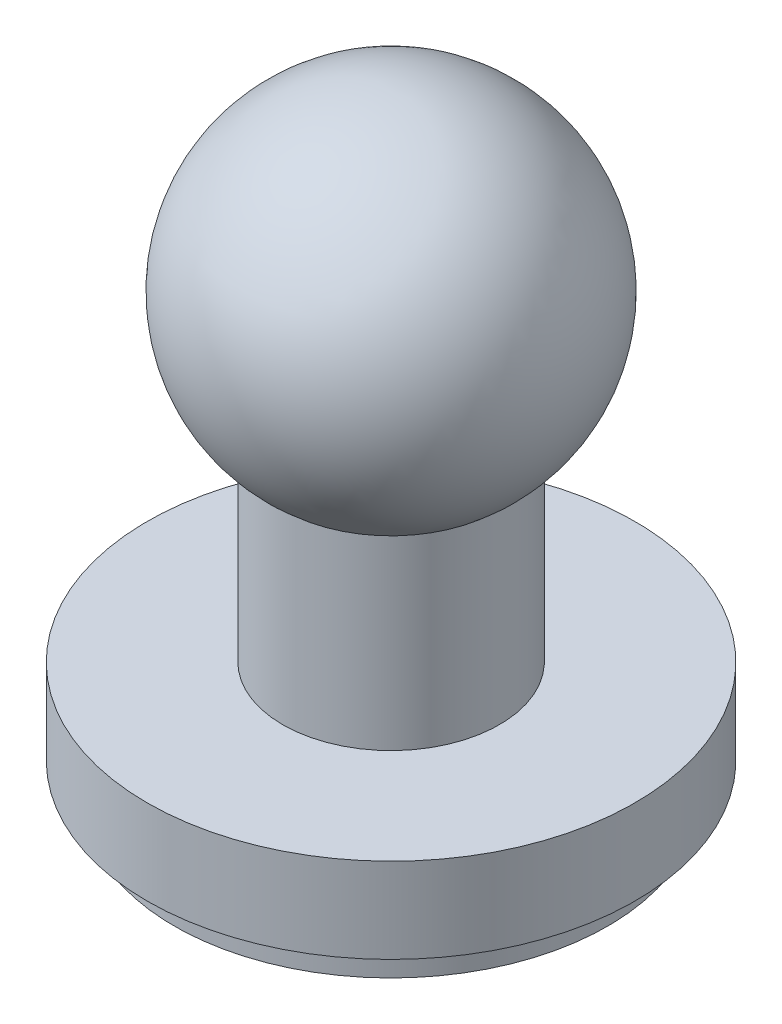
ISO-10303-21;
HEADER;
FILE_DESCRIPTION(('STEP AP214'),'2;1');
FILE_NAME('part.step','',(''),(''),'','','');
FILE_SCHEMA(('AUTOMOTIVE_DESIGN { 1 0 10303 214 1 1 1 1 }'));
ENDSEC;
DATA;
#1=APPLICATION_CONTEXT('core data for automotive mechanical design processes');
#2=APPLICATION_PROTOCOL_DEFINITION('international standard','automotive_design',2000,#1);
#3=PRODUCT_CONTEXT('',#1,'mechanical');
#4=PRODUCT('Part','Part','',(#3));
#5=PRODUCT_RELATED_PRODUCT_CATEGORY('part','',(#4));
#6=PRODUCT_DEFINITION_FORMATION('','',#4);
#7=PRODUCT_DEFINITION_CONTEXT('part definition',#1,'design');
#8=PRODUCT_DEFINITION('design','',#6,#7);
#9=PRODUCT_DEFINITION_SHAPE('','',#8);
#10=(LENGTH_UNIT() NAMED_UNIT(*) SI_UNIT(.MILLI.,.METRE.));
#11=(NAMED_UNIT(*) PLANE_ANGLE_UNIT() SI_UNIT($,.RADIAN.));
#12=(NAMED_UNIT(*) SI_UNIT($,.STERADIAN.) SOLID_ANGLE_UNIT());
#13=UNCERTAINTY_MEASURE_WITH_UNIT(LENGTH_MEASURE(1.E-05),#10,'distance_accuracy_value','');
#14=(GEOMETRIC_REPRESENTATION_CONTEXT(3) GLOBAL_UNCERTAINTY_ASSIGNED_CONTEXT((#13)) GLOBAL_UNIT_ASSIGNED_CONTEXT((#10,
#11,#12)) REPRESENTATION_CONTEXT('',''));
#15=CARTESIAN_POINT('',(0.,0.,0.));
#16=DIRECTION('',(0.,0.,1.));
#17=DIRECTION('',(1.,0.,0.));
#18=AXIS2_PLACEMENT_3D('',#15,#16,#17);
#19=CARTESIAN_POINT('',(0.,7.5,0.));
#20=DIRECTION('',(0.,-1.,0.));
#21=DIRECTION('',(0.,0.,-1.));
#22=AXIS2_PLACEMENT_3D('',#19,#20,#21);
#23=CYLINDRICAL_SURFACE('',#22,2.);
#24=CARTESIAN_POINT('',(0.,1.57,0.));
#25=DIRECTION('',(0.,1.,0.));
#26=DIRECTION('',(0.,0.,1.));
#27=AXIS2_PLACEMENT_3D('',#24,#25,#26);
#28=CIRCLE('',#27,2.);
#29=CARTESIAN_POINT('',(0.,1.57,2.));
#30=VERTEX_POINT('',#29);
#31=EDGE_CURVE('E45',#30,#30,#28,.T.);
#32=ORIENTED_EDGE('',*,*,#31,.T.);
#33=EDGE_LOOP('',(#32));
#34=FACE_BOUND('',#33,.T.);
#35=CARTESIAN_POINT('',(0.,5.00200080064064,0.));
#36=DIRECTION('',(0.,1.,0.));
#37=DIRECTION('',(0.,0.,1.));
#38=AXIS2_PLACEMENT_3D('',#35,#36,#37);
#39=CIRCLE('',#38,2.);
#40=CARTESIAN_POINT('',(0.,5.00200080064064,2.));
#41=VERTEX_POINT('',#40);
#42=EDGE_CURVE('E37',#41,#41,#39,.T.);
#43=ORIENTED_EDGE('',*,*,#42,.F.);
#44=EDGE_LOOP('',(#43));
#45=FACE_BOUND('',#44,.T.);
#46=ADVANCED_FACE('F33',(#34,#45),#23,.T.);
#47=CARTESIAN_POINT('',(0.,1.57,0.));
#48=DIRECTION('',(0.,-1.,0.));
#49=DIRECTION('',(0.,0.,-1.));
#50=AXIS2_PLACEMENT_3D('',#47,#48,#49);
#51=CYLINDRICAL_SURFACE('',#50,4.5);
#52=CARTESIAN_POINT('',(0.,1.57,0.));
#53=DIRECTION('',(0.,1.,0.));
#54=DIRECTION('',(0.,0.,1.));
#55=AXIS2_PLACEMENT_3D('',#52,#53,#54);
#56=CIRCLE('',#55,4.5);
#57=CARTESIAN_POINT('',(0.,1.57,4.5));
#58=VERTEX_POINT('',#57);
#59=EDGE_CURVE('E51',#58,#58,#56,.T.);
#60=ORIENTED_EDGE('',*,*,#59,.F.);
#61=EDGE_LOOP('',(#60));
#62=FACE_BOUND('',#61,.T.);
#63=CARTESIAN_POINT('',(0.,0.,0.));
#64=DIRECTION('',(0.,1.,0.));
#65=DIRECTION('',(0.,0.,1.));
#66=AXIS2_PLACEMENT_3D('',#63,#64,#65);
#67=CIRCLE('',#66,4.5);
#68=CARTESIAN_POINT('',(0.,0.,4.5));
#69=VERTEX_POINT('',#68);
#70=EDGE_CURVE('E53',#69,#69,#67,.T.);
#71=ORIENTED_EDGE('',*,*,#70,.T.);
#72=EDGE_LOOP('',(#71));
#73=FACE_BOUND('',#72,.T.);
#74=ADVANCED_FACE('F35',(#62,#73),#51,.T.);
#75=CARTESIAN_POINT('',(0.,1.57,0.));
#76=DIRECTION('',(0.,1.,0.));
#77=DIRECTION('',(0.,0.,1.));
#78=AXIS2_PLACEMENT_3D('',#75,#76,#77);
#79=PLANE('',#78);
#80=ORIENTED_EDGE('',*,*,#31,.F.);
#81=EDGE_LOOP('',(#80));
#82=FACE_BOUND('',#81,.T.);
#83=ORIENTED_EDGE('',*,*,#59,.T.);
#84=EDGE_LOOP('',(#83));
#85=FACE_BOUND('',#84,.T.);
#86=ADVANCED_FACE('F80',(#82,#85),#79,.T.);
#87=CARTESIAN_POINT('',(0.,0.,0.));
#88=DIRECTION('',(0.,1.,0.));
#89=DIRECTION('',(0.,0.,1.));
#90=AXIS2_PLACEMENT_3D('',#87,#88,#89);
#91=PLANE('',#90);
#92=CARTESIAN_POINT('',(0.,0.,0.));
#93=DIRECTION('',(0.,-1.,0.));
#94=DIRECTION('',(0.,0.,-1.));
#95=AXIS2_PLACEMENT_3D('',#92,#93,#94);
#96=CIRCLE('',#95,4.);
#97=CARTESIAN_POINT('',(0.,0.,-4.));
#98=VERTEX_POINT('',#97);
#99=EDGE_CURVE('E10',#98,#98,#96,.T.);
#100=ORIENTED_EDGE('',*,*,#99,.F.);
#101=EDGE_LOOP('',(#100));
#102=FACE_BOUND('',#101,.T.);
#103=ORIENTED_EDGE('',*,*,#70,.F.);
#104=EDGE_LOOP('',(#103));
#105=FACE_BOUND('',#104,.T.);
#106=ADVANCED_FACE('F71',(#102,#105),#91,.F.);
#107=CARTESIAN_POINT('',(0.,7.5,0.));
#108=DIRECTION('',(0.,0.,-1.));
#109=DIRECTION('',(1.,0.,0.));
#110=AXIS2_PLACEMENT_3D('',#107,#108,#109);
#111=SPHERICAL_SURFACE('',#110,3.2);
#112=CARTESIAN_POINT('',(0.,7.5,0.));
#113=DIRECTION('',(0.,1.,0.));
#114=DIRECTION('',(0.,0.,1.));
#115=AXIS2_PLACEMENT_3D('',#112,#113,#114);
#116=SPHERICAL_SURFACE('',#115,3.2);
#117=ORIENTED_EDGE('',*,*,#42,.T.);
#118=EDGE_LOOP('',(#117));
#119=FACE_BOUND('',#118,.T.);
#120=ADVANCED_FACE('F64',(#119),#116,.T.);
#121=CARTESIAN_POINT('',(0.,-0.65,0.));
#122=DIRECTION('',(0.,1.,0.));
#123=DIRECTION('',(0.,0.,1.));
#124=AXIS2_PLACEMENT_3D('',#121,#122,#123);
#125=CYLINDRICAL_SURFACE('',#124,4.);
#126=CARTESIAN_POINT('',(0.,-0.65,0.));
#127=DIRECTION('',(0.,-1.,0.));
#128=DIRECTION('',(0.,0.,-1.));
#129=AXIS2_PLACEMENT_3D('',#126,#127,#128);
#130=CIRCLE('',#129,4.);
#131=CARTESIAN_POINT('',(0.,-0.65,-4.));
#132=VERTEX_POINT('',#131);
#133=EDGE_CURVE('E48',#132,#132,#130,.T.);
#134=ORIENTED_EDGE('',*,*,#133,.F.);
#135=EDGE_LOOP('',(#134));
#136=FACE_BOUND('',#135,.T.);
#137=ORIENTED_EDGE('',*,*,#99,.T.);
#138=EDGE_LOOP('',(#137));
#139=FACE_BOUND('',#138,.T.);
#140=ADVANCED_FACE('F62',(#136,#139),#125,.T.);
#141=CARTESIAN_POINT('',(0.,-0.65,0.));
#142=DIRECTION('',(0.,-1.,0.));
#143=DIRECTION('',(0.,0.,-1.));
#144=AXIS2_PLACEMENT_3D('',#141,#142,#143);
#145=PLANE('',#144);
#146=ORIENTED_EDGE('',*,*,#133,.T.);
#147=EDGE_LOOP('',(#146));
#148=FACE_BOUND('',#147,.T.);
#149=ADVANCED_FACE('F60',(#148),#145,.T.);
#150=CLOSED_SHELL('',(#46,#74,#86,#106,#120,#140,#149));
#151=MANIFOLD_SOLID_BREP('B2',#150);
#152=ADVANCED_BREP_SHAPE_REPRESENTATION('',(#18,#151),#14);
#153=SHAPE_DEFINITION_REPRESENTATION(#9,#152);
ENDSEC;
END-ISO-10303-21;
